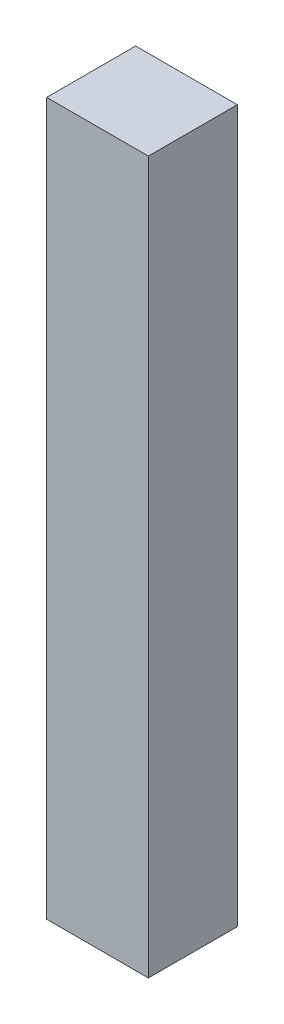
ISO-10303-21;
HEADER;
FILE_DESCRIPTION(('STEP AP214'),'2;1');
FILE_NAME('part.step','',(''),(''),'','','');
FILE_SCHEMA(('AUTOMOTIVE_DESIGN { 1 0 10303 214 1 1 1 1 }'));
ENDSEC;
DATA;
#1=APPLICATION_CONTEXT('core data for automotive mechanical design processes');
#2=APPLICATION_PROTOCOL_DEFINITION('international standard','automotive_design',2000,#1);
#3=PRODUCT_CONTEXT('',#1,'mechanical');
#4=PRODUCT('Part','Part','',(#3));
#5=PRODUCT_RELATED_PRODUCT_CATEGORY('part','',(#4));
#6=PRODUCT_DEFINITION_FORMATION('','',#4);
#7=PRODUCT_DEFINITION_CONTEXT('part definition',#1,'design');
#8=PRODUCT_DEFINITION('design','',#6,#7);
#9=PRODUCT_DEFINITION_SHAPE('','',#8);
#10=(LENGTH_UNIT() NAMED_UNIT(*) SI_UNIT(.MILLI.,.METRE.));
#11=(NAMED_UNIT(*) PLANE_ANGLE_UNIT() SI_UNIT($,.RADIAN.));
#12=(NAMED_UNIT(*) SI_UNIT($,.STERADIAN.) SOLID_ANGLE_UNIT());
#13=UNCERTAINTY_MEASURE_WITH_UNIT(LENGTH_MEASURE(1.E-05),#10,'distance_accuracy_value','');
#14=(GEOMETRIC_REPRESENTATION_CONTEXT(3) GLOBAL_UNCERTAINTY_ASSIGNED_CONTEXT((#13)) GLOBAL_UNIT_ASSIGNED_CONTEXT((#10,
#11,#12)) REPRESENTATION_CONTEXT('',''));
#15=CARTESIAN_POINT('',(0.,0.,0.));
#16=DIRECTION('',(0.,0.,1.));
#17=DIRECTION('',(1.,0.,0.));
#18=AXIS2_PLACEMENT_3D('',#15,#16,#17);
#19=CARTESIAN_POINT('',(4.,28.,-3.5));
#20=DIRECTION('',(-1.,0.,0.));
#21=DIRECTION('',(0.,0.,1.));
#22=AXIS2_PLACEMENT_3D('',#19,#20,#21);
#23=PLANE('',#22);
#24=DIRECTION('',(0.,0.,-1.));
#25=VECTOR('',#24,1.);
#26=CARTESIAN_POINT('',(4.,-28.,-3.5));
#27=LINE('',#26,#25);
#28=CARTESIAN_POINT('',(4.,-28.,3.5));
#29=VERTEX_POINT('',#28);
#30=CARTESIAN_POINT('',(4.,-28.,-3.5));
#31=VERTEX_POINT('',#30);
#32=EDGE_CURVE('E100',#29,#31,#27,.T.);
#33=ORIENTED_EDGE('',*,*,#32,.T.);
#34=DIRECTION('',(0.,-1.,0.));
#35=VECTOR('',#34,1.);
#36=CARTESIAN_POINT('',(4.,28.,-3.5));
#37=LINE('',#36,#35);
#38=CARTESIAN_POINT('',(4.,28.,-3.5));
#39=VERTEX_POINT('',#38);
#40=EDGE_CURVE('E11',#39,#31,#37,.T.);
#41=ORIENTED_EDGE('',*,*,#40,.F.);
#42=DIRECTION('',(0.,0.,-1.));
#43=VECTOR('',#42,1.);
#44=CARTESIAN_POINT('',(4.,28.,-3.5));
#45=LINE('',#44,#43);
#46=CARTESIAN_POINT('',(4.,28.,3.5));
#47=VERTEX_POINT('',#46);
#48=EDGE_CURVE('E88',#47,#39,#45,.T.);
#49=ORIENTED_EDGE('',*,*,#48,.F.);
#50=DIRECTION('',(0.,-1.,0.));
#51=VECTOR('',#50,1.);
#52=CARTESIAN_POINT('',(4.,28.,3.5));
#53=LINE('',#52,#51);
#54=EDGE_CURVE('E96',#47,#29,#53,.T.);
#55=ORIENTED_EDGE('',*,*,#54,.T.);
#56=EDGE_LOOP('',(#33,#41,#49,#55));
#57=FACE_BOUND('',#56,.T.);
#58=ADVANCED_FACE('F37',(#57),#23,.F.);
#59=CARTESIAN_POINT('',(-4.,28.,-3.5));
#60=DIRECTION('',(0.,0.,1.));
#61=DIRECTION('',(1.,0.,0.));
#62=AXIS2_PLACEMENT_3D('',#59,#60,#61);
#63=PLANE('',#62);
#64=DIRECTION('',(-1.,0.,0.));
#65=VECTOR('',#64,1.);
#66=CARTESIAN_POINT('',(-4.,-28.,-3.5));
#67=LINE('',#66,#65);
#68=CARTESIAN_POINT('',(-4.,-28.,-3.5));
#69=VERTEX_POINT('',#68);
#70=EDGE_CURVE('E92',#31,#69,#67,.T.);
#71=ORIENTED_EDGE('',*,*,#70,.T.);
#72=DIRECTION('',(0.,-1.,0.));
#73=VECTOR('',#72,1.);
#74=CARTESIAN_POINT('',(-4.,28.,-3.5));
#75=LINE('',#74,#73);
#76=CARTESIAN_POINT('',(-4.,28.,-3.5));
#77=VERTEX_POINT('',#76);
#78=EDGE_CURVE('E45',#77,#69,#75,.T.);
#79=ORIENTED_EDGE('',*,*,#78,.F.);
#80=DIRECTION('',(-1.,0.,0.));
#81=VECTOR('',#80,1.);
#82=CARTESIAN_POINT('',(-4.,28.,-3.5));
#83=LINE('',#82,#81);
#84=EDGE_CURVE('E83',#39,#77,#83,.T.);
#85=ORIENTED_EDGE('',*,*,#84,.F.);
#86=ORIENTED_EDGE('',*,*,#40,.T.);
#87=EDGE_LOOP('',(#71,#79,#85,#86));
#88=FACE_BOUND('',#87,.T.);
#89=ADVANCED_FACE('F91',(#88),#63,.F.);
#90=CARTESIAN_POINT('',(-4.,28.,-3.5));
#91=DIRECTION('',(1.,0.,0.));
#92=DIRECTION('',(0.,0.,-1.));
#93=AXIS2_PLACEMENT_3D('',#90,#91,#92);
#94=PLANE('',#93);
#95=DIRECTION('',(0.,0.,1.));
#96=VECTOR('',#95,1.);
#97=CARTESIAN_POINT('',(-4.,-28.,-3.5));
#98=LINE('',#97,#96);
#99=CARTESIAN_POINT('',(-4.,-28.,3.5));
#100=VERTEX_POINT('',#99);
#101=EDGE_CURVE('E70',#69,#100,#98,.T.);
#102=ORIENTED_EDGE('',*,*,#101,.T.);
#103=DIRECTION('',(0.,-1.,0.));
#104=VECTOR('',#103,1.);
#105=CARTESIAN_POINT('',(-4.,28.,3.5));
#106=LINE('',#105,#104);
#107=CARTESIAN_POINT('',(-4.,28.,3.5));
#108=VERTEX_POINT('',#107);
#109=EDGE_CURVE('E93',#108,#100,#106,.T.);
#110=ORIENTED_EDGE('',*,*,#109,.F.);
#111=DIRECTION('',(0.,0.,1.));
#112=VECTOR('',#111,1.);
#113=CARTESIAN_POINT('',(-4.,28.,-3.5));
#114=LINE('',#113,#112);
#115=EDGE_CURVE('E86',#77,#108,#114,.T.);
#116=ORIENTED_EDGE('',*,*,#115,.F.);
#117=ORIENTED_EDGE('',*,*,#78,.T.);
#118=EDGE_LOOP('',(#102,#110,#116,#117));
#119=FACE_BOUND('',#118,.T.);
#120=ADVANCED_FACE('F94',(#119),#94,.F.);
#121=CARTESIAN_POINT('',(-4.,28.,3.5));
#122=DIRECTION('',(0.,0.,-1.));
#123=DIRECTION('',(-1.,0.,0.));
#124=AXIS2_PLACEMENT_3D('',#121,#122,#123);
#125=PLANE('',#124);
#126=DIRECTION('',(1.,0.,0.));
#127=VECTOR('',#126,1.);
#128=CARTESIAN_POINT('',(-4.,-28.,3.5));
#129=LINE('',#128,#127);
#130=EDGE_CURVE('E76',#100,#29,#129,.T.);
#131=ORIENTED_EDGE('',*,*,#130,.T.);
#132=ORIENTED_EDGE('',*,*,#54,.F.);
#133=DIRECTION('',(1.,0.,0.));
#134=VECTOR('',#133,1.);
#135=CARTESIAN_POINT('',(-4.,28.,3.5));
#136=LINE('',#135,#134);
#137=EDGE_CURVE('E53',#108,#47,#136,.T.);
#138=ORIENTED_EDGE('',*,*,#137,.F.);
#139=ORIENTED_EDGE('',*,*,#109,.T.);
#140=EDGE_LOOP('',(#131,#132,#138,#139));
#141=FACE_BOUND('',#140,.T.);
#142=ADVANCED_FACE('F107',(#141),#125,.F.);
#143=CARTESIAN_POINT('',(0.,28.,0.));
#144=DIRECTION('',(0.,1.,0.));
#145=DIRECTION('',(0.,0.,1.));
#146=AXIS2_PLACEMENT_3D('',#143,#144,#145);
#147=PLANE('',#146);
#148=ORIENTED_EDGE('',*,*,#48,.T.);
#149=ORIENTED_EDGE('',*,*,#84,.T.);
#150=ORIENTED_EDGE('',*,*,#115,.T.);
#151=ORIENTED_EDGE('',*,*,#137,.T.);
#152=EDGE_LOOP('',(#148,#149,#150,#151));
#153=FACE_BOUND('',#152,.T.);
#154=ADVANCED_FACE('F84',(#153),#147,.T.);
#155=CARTESIAN_POINT('',(0.,-28.,0.));
#156=DIRECTION('',(0.,1.,0.));
#157=DIRECTION('',(0.,0.,1.));
#158=AXIS2_PLACEMENT_3D('',#155,#156,#157);
#159=PLANE('',#158);
#160=ORIENTED_EDGE('',*,*,#32,.F.);
#161=ORIENTED_EDGE('',*,*,#130,.F.);
#162=ORIENTED_EDGE('',*,*,#101,.F.);
#163=ORIENTED_EDGE('',*,*,#70,.F.);
#164=EDGE_LOOP('',(#160,#161,#162,#163));
#165=FACE_BOUND('',#164,.T.);
#166=ADVANCED_FACE('F110',(#165),#159,.F.);
#167=CLOSED_SHELL('',(#58,#89,#120,#142,#154,#166));
#168=MANIFOLD_SOLID_BREP('B2',#167);
#169=ADVANCED_BREP_SHAPE_REPRESENTATION('',(#18,#168),#14);
#170=SHAPE_DEFINITION_REPRESENTATION(#9,#169);
ENDSEC;
END-ISO-10303-21;
